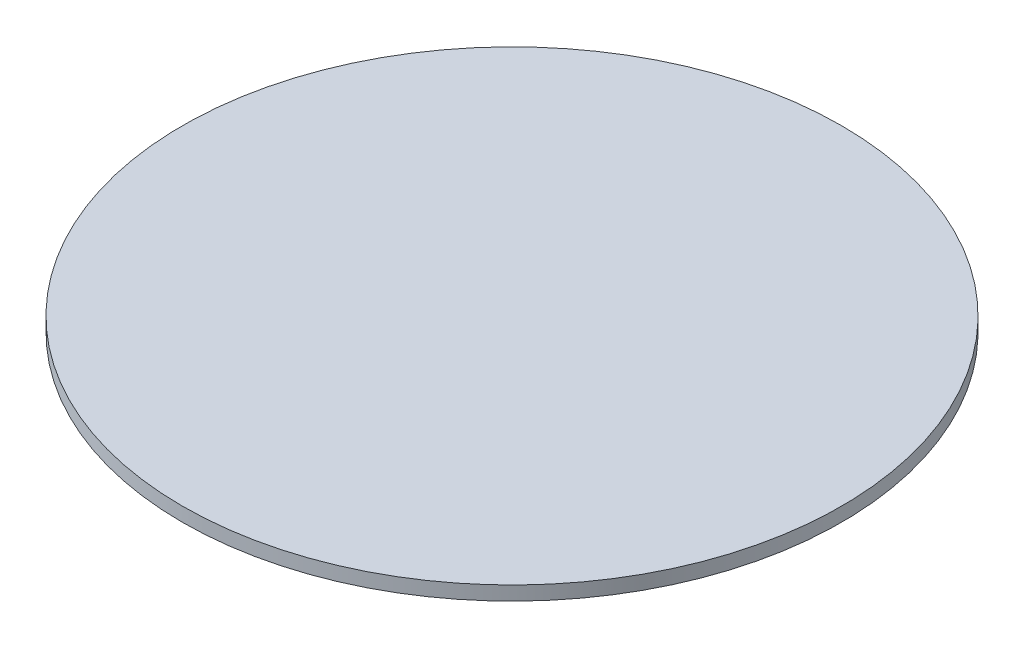
ISO-10303-21;
HEADER;
FILE_DESCRIPTION(('STEP AP214'),'2;1');
FILE_NAME('part.step','',(''),(''),'','','');
FILE_SCHEMA(('AUTOMOTIVE_DESIGN { 1 0 10303 214 1 1 1 1 }'));
ENDSEC;
DATA;
#1=APPLICATION_CONTEXT('core data for automotive mechanical design processes');
#2=APPLICATION_PROTOCOL_DEFINITION('international standard','automotive_design',2000,#1);
#3=PRODUCT_CONTEXT('',#1,'mechanical');
#4=PRODUCT('Part','Part','',(#3));
#5=PRODUCT_RELATED_PRODUCT_CATEGORY('part','',(#4));
#6=PRODUCT_DEFINITION_FORMATION('','',#4);
#7=PRODUCT_DEFINITION_CONTEXT('part definition',#1,'design');
#8=PRODUCT_DEFINITION('design','',#6,#7);
#9=PRODUCT_DEFINITION_SHAPE('','',#8);
#10=(LENGTH_UNIT() NAMED_UNIT(*) SI_UNIT(.MILLI.,.METRE.));
#11=(NAMED_UNIT(*) PLANE_ANGLE_UNIT() SI_UNIT($,.RADIAN.));
#12=(NAMED_UNIT(*) SI_UNIT($,.STERADIAN.) SOLID_ANGLE_UNIT());
#13=UNCERTAINTY_MEASURE_WITH_UNIT(LENGTH_MEASURE(1.E-05),#10,'distance_accuracy_value','');
#14=(GEOMETRIC_REPRESENTATION_CONTEXT(3) GLOBAL_UNCERTAINTY_ASSIGNED_CONTEXT((#13)) GLOBAL_UNIT_ASSIGNED_CONTEXT((#10,
#11,#12)) REPRESENTATION_CONTEXT('',''));
#15=CARTESIAN_POINT('',(0.,0.,0.));
#16=DIRECTION('',(0.,0.,1.));
#17=DIRECTION('',(1.,0.,0.));
#18=AXIS2_PLACEMENT_3D('',#15,#16,#17);
#19=CARTESIAN_POINT('',(0.,0.17,0.));
#20=DIRECTION('',(0.,-1.,0.));
#21=DIRECTION('',(0.,0.,-1.));
#22=AXIS2_PLACEMENT_3D('',#19,#20,#21);
#23=CYLINDRICAL_SURFACE('',#22,4.);
#24=CARTESIAN_POINT('',(0.,0.17,0.));
#25=DIRECTION('',(0.,1.,0.));
#26=DIRECTION('',(0.,0.,1.));
#27=AXIS2_PLACEMENT_3D('',#24,#25,#26);
#28=CIRCLE('',#27,4.);
#29=CARTESIAN_POINT('',(0.,0.17,4.));
#30=VERTEX_POINT('',#29);
#31=EDGE_CURVE('E10',#30,#30,#28,.T.);
#32=ORIENTED_EDGE('',*,*,#31,.F.);
#33=EDGE_LOOP('',(#32));
#34=FACE_BOUND('',#33,.T.);
#35=CARTESIAN_POINT('',(0.,0.,0.));
#36=DIRECTION('',(0.,1.,0.));
#37=DIRECTION('',(0.,0.,1.));
#38=AXIS2_PLACEMENT_3D('',#35,#36,#37);
#39=CIRCLE('',#38,4.);
#40=CARTESIAN_POINT('',(0.,0.,4.));
#41=VERTEX_POINT('',#40);
#42=EDGE_CURVE('E36',#41,#41,#39,.T.);
#43=ORIENTED_EDGE('',*,*,#42,.T.);
#44=EDGE_LOOP('',(#43));
#45=FACE_BOUND('',#44,.T.);
#46=ADVANCED_FACE('F33',(#34,#45),#23,.T.);
#47=CARTESIAN_POINT('',(0.,0.17,0.));
#48=DIRECTION('',(0.,1.,0.));
#49=DIRECTION('',(0.,0.,1.));
#50=AXIS2_PLACEMENT_3D('',#47,#48,#49);
#51=PLANE('',#50);
#52=ORIENTED_EDGE('',*,*,#31,.T.);
#53=EDGE_LOOP('',(#52));
#54=FACE_BOUND('',#53,.T.);
#55=ADVANCED_FACE('F48',(#54),#51,.T.);
#56=CARTESIAN_POINT('',(0.,0.,0.));
#57=DIRECTION('',(0.,1.,0.));
#58=DIRECTION('',(0.,0.,1.));
#59=AXIS2_PLACEMENT_3D('',#56,#57,#58);
#60=PLANE('',#59);
#61=ORIENTED_EDGE('',*,*,#42,.F.);
#62=EDGE_LOOP('',(#61));
#63=FACE_BOUND('',#62,.T.);
#64=ADVANCED_FACE('F46',(#63),#60,.F.);
#65=CLOSED_SHELL('',(#46,#55,#64));
#66=MANIFOLD_SOLID_BREP('B2',#65);
#67=ADVANCED_BREP_SHAPE_REPRESENTATION('',(#18,#66),#14);
#68=SHAPE_DEFINITION_REPRESENTATION(#9,#67);
ENDSEC;
END-ISO-10303-21;
